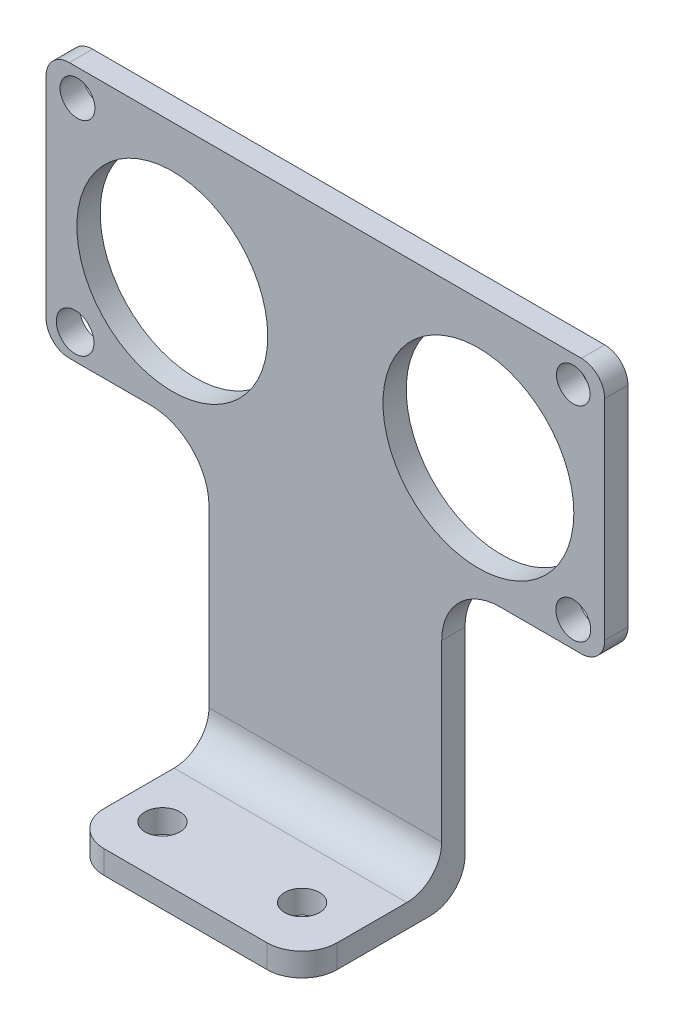
ISO-10303-21;
HEADER;
FILE_DESCRIPTION(('STEP AP214'),'2;1');
FILE_NAME('part.step','',(''),(''),'','','');
FILE_SCHEMA(('AUTOMOTIVE_DESIGN { 1 0 10303 214 1 1 1 1 }'));
ENDSEC;
DATA;
#1=APPLICATION_CONTEXT('core data for automotive mechanical design processes');
#2=APPLICATION_PROTOCOL_DEFINITION('international standard','automotive_design',2000,#1);
#3=PRODUCT_CONTEXT('',#1,'mechanical');
#4=PRODUCT('Part','Part','',(#3));
#5=PRODUCT_RELATED_PRODUCT_CATEGORY('part','',(#4));
#6=PRODUCT_DEFINITION_FORMATION('','',#4);
#7=PRODUCT_DEFINITION_CONTEXT('part definition',#1,'design');
#8=PRODUCT_DEFINITION('design','',#6,#7);
#9=PRODUCT_DEFINITION_SHAPE('','',#8);
#10=(LENGTH_UNIT() NAMED_UNIT(*) SI_UNIT(.MILLI.,.METRE.));
#11=(NAMED_UNIT(*) PLANE_ANGLE_UNIT() SI_UNIT($,.RADIAN.));
#12=(NAMED_UNIT(*) SI_UNIT($,.STERADIAN.) SOLID_ANGLE_UNIT());
#13=UNCERTAINTY_MEASURE_WITH_UNIT(LENGTH_MEASURE(1.E-05),#10,'distance_accuracy_value','');
#14=(GEOMETRIC_REPRESENTATION_CONTEXT(3) GLOBAL_UNCERTAINTY_ASSIGNED_CONTEXT((#13)) GLOBAL_UNIT_ASSIGNED_CONTEXT((#10,
#11,#12)) REPRESENTATION_CONTEXT('',''));
#15=CARTESIAN_POINT('',(0.,0.,0.));
#16=DIRECTION('',(0.,0.,1.));
#17=DIRECTION('',(1.,0.,0.));
#18=AXIS2_PLACEMENT_3D('',#15,#16,#17);
#19=CARTESIAN_POINT('',(24.2208067940552,-6.44798301486199,2.));
#20=DIRECTION('',(0.,0.,-1.));
#21=DIRECTION('',(-1.,0.,0.));
#22=AXIS2_PLACEMENT_3D('',#19,#20,#21);
#23=CYLINDRICAL_SURFACE('',#22,2.);
#24=CARTESIAN_POINT('',(24.2208067940552,-6.44798301486199,0.));
#25=DIRECTION('',(0.,0.,1.));
#26=DIRECTION('',(1.,0.,0.));
#27=AXIS2_PLACEMENT_3D('',#24,#25,#26);
#28=CIRCLE('',#27,2.);
#29=CARTESIAN_POINT('',(24.2208067940552,-8.44798301486199,0.));
#30=VERTEX_POINT('',#29);
#31=CARTESIAN_POINT('',(26.2208067940552,-6.44798301486198,0.));
#32=VERTEX_POINT('',#31);
#33=EDGE_CURVE('E195',#30,#32,#28,.T.);
#34=ORIENTED_EDGE('',*,*,#33,.T.);
#35=DIRECTION('',(0.,0.,-1.));
#36=VECTOR('',#35,1.);
#37=CARTESIAN_POINT('',(26.2208067940552,-6.44798301486198,2.));
#38=LINE('',#37,#36);
#39=CARTESIAN_POINT('',(26.2208067940552,-6.44798301486198,2.));
#40=VERTEX_POINT('',#39);
#41=EDGE_CURVE('E174',#40,#32,#38,.T.);
#42=ORIENTED_EDGE('',*,*,#41,.F.);
#43=CARTESIAN_POINT('',(24.2208067940552,-6.44798301486199,2.));
#44=DIRECTION('',(0.,0.,1.));
#45=DIRECTION('',(1.,0.,0.));
#46=AXIS2_PLACEMENT_3D('',#43,#44,#45);
#47=CIRCLE('',#46,2.);
#48=CARTESIAN_POINT('',(24.2208067940552,-8.44798301486199,2.));
#49=VERTEX_POINT('',#48);
#50=EDGE_CURVE('E181',#49,#40,#47,.T.);
#51=ORIENTED_EDGE('',*,*,#50,.F.);
#52=DIRECTION('',(0.,0.,-1.));
#53=VECTOR('',#52,1.);
#54=CARTESIAN_POINT('',(24.2208067940552,-8.44798301486199,2.));
#55=LINE('',#54,#53);
#56=EDGE_CURVE('E316',#49,#30,#55,.T.);
#57=ORIENTED_EDGE('',*,*,#56,.T.);
#58=EDGE_LOOP('',(#34,#42,#51,#57));
#59=FACE_BOUND('',#58,.T.);
#60=ADVANCED_FACE('F33',(#59),#23,.T.);
#61=CARTESIAN_POINT('',(26.2208067940552,11.552016985138,2.));
#62=DIRECTION('',(-1.,0.,0.));
#63=DIRECTION('',(0.,-1.,0.));
#64=AXIS2_PLACEMENT_3D('',#61,#62,#63);
#65=PLANE('',#64);
#66=DIRECTION('',(0.,1.,0.));
#67=VECTOR('',#66,1.);
#68=CARTESIAN_POINT('',(26.2208067940552,11.552016985138,0.));
#69=LINE('',#68,#67);
#70=CARTESIAN_POINT('',(26.2208067940552,11.552016985138,0.));
#71=VERTEX_POINT('',#70);
#72=EDGE_CURVE('E318',#32,#71,#69,.T.);
#73=ORIENTED_EDGE('',*,*,#72,.T.);
#74=DIRECTION('',(0.,0.,-1.));
#75=VECTOR('',#74,1.);
#76=CARTESIAN_POINT('',(26.2208067940552,11.552016985138,2.));
#77=LINE('',#76,#75);
#78=CARTESIAN_POINT('',(26.2208067940552,11.552016985138,2.));
#79=VERTEX_POINT('',#78);
#80=EDGE_CURVE('E177',#79,#71,#77,.T.);
#81=ORIENTED_EDGE('',*,*,#80,.F.);
#82=DIRECTION('',(0.,1.,0.));
#83=VECTOR('',#82,1.);
#84=CARTESIAN_POINT('',(26.2208067940552,11.552016985138,2.));
#85=LINE('',#84,#83);
#86=EDGE_CURVE('E170',#40,#79,#85,.T.);
#87=ORIENTED_EDGE('',*,*,#86,.F.);
#88=ORIENTED_EDGE('',*,*,#41,.T.);
#89=EDGE_LOOP('',(#73,#81,#87,#88));
#90=FACE_BOUND('',#89,.T.);
#91=ADVANCED_FACE('F172',(#90),#65,.F.);
#92=CARTESIAN_POINT('',(24.2208067940552,11.552016985138,2.));
#93=DIRECTION('',(0.,0.,-1.));
#94=DIRECTION('',(-1.,0.,0.));
#95=AXIS2_PLACEMENT_3D('',#92,#93,#94);
#96=CYLINDRICAL_SURFACE('',#95,2.);
#97=CARTESIAN_POINT('',(24.2208067940552,11.552016985138,0.));
#98=DIRECTION('',(0.,0.,1.));
#99=DIRECTION('',(-1.,0.,0.));
#100=AXIS2_PLACEMENT_3D('',#97,#98,#99);
#101=CIRCLE('',#100,2.);
#102=CARTESIAN_POINT('',(24.2208067940552,13.552016985138,0.));
#103=VERTEX_POINT('',#102);
#104=EDGE_CURVE('E320',#71,#103,#101,.T.);
#105=ORIENTED_EDGE('',*,*,#104,.T.);
#106=DIRECTION('',(0.,0.,-1.));
#107=VECTOR('',#106,1.);
#108=CARTESIAN_POINT('',(24.2208067940552,13.552016985138,2.));
#109=LINE('',#108,#107);
#110=CARTESIAN_POINT('',(24.2208067940552,13.552016985138,2.));
#111=VERTEX_POINT('',#110);
#112=EDGE_CURVE('E201',#111,#103,#109,.T.);
#113=ORIENTED_EDGE('',*,*,#112,.F.);
#114=CARTESIAN_POINT('',(24.2208067940552,11.552016985138,2.));
#115=DIRECTION('',(0.,0.,1.));
#116=DIRECTION('',(-1.,0.,0.));
#117=AXIS2_PLACEMENT_3D('',#114,#115,#116);
#118=CIRCLE('',#117,2.);
#119=EDGE_CURVE('E180',#79,#111,#118,.T.);
#120=ORIENTED_EDGE('',*,*,#119,.F.);
#121=ORIENTED_EDGE('',*,*,#80,.T.);
#122=EDGE_LOOP('',(#105,#113,#120,#121));
#123=FACE_BOUND('',#122,.T.);
#124=ADVANCED_FACE('F394',(#123),#96,.T.);
#125=CARTESIAN_POINT('',(-19.7791932059448,13.552016985138,2.));
#126=DIRECTION('',(0.,-1.,0.));
#127=DIRECTION('',(0.,0.,-1.));
#128=AXIS2_PLACEMENT_3D('',#125,#126,#127);
#129=PLANE('',#128);
#130=DIRECTION('',(-1.,0.,0.));
#131=VECTOR('',#130,1.);
#132=CARTESIAN_POINT('',(-19.7791932059448,13.552016985138,0.));
#133=LINE('',#132,#131);
#134=CARTESIAN_POINT('',(-19.7791932059448,13.552016985138,0.));
#135=VERTEX_POINT('',#134);
#136=EDGE_CURVE('E322',#103,#135,#133,.T.);
#137=ORIENTED_EDGE('',*,*,#136,.T.);
#138=DIRECTION('',(0.,0.,-1.));
#139=VECTOR('',#138,1.);
#140=CARTESIAN_POINT('',(-19.7791932059448,13.552016985138,2.));
#141=LINE('',#140,#139);
#142=CARTESIAN_POINT('',(-19.7791932059448,13.552016985138,2.));
#143=VERTEX_POINT('',#142);
#144=EDGE_CURVE('E367',#143,#135,#141,.T.);
#145=ORIENTED_EDGE('',*,*,#144,.F.);
#146=DIRECTION('',(-1.,0.,0.));
#147=VECTOR('',#146,1.);
#148=CARTESIAN_POINT('',(-19.7791932059448,13.552016985138,2.));
#149=LINE('',#148,#147);
#150=EDGE_CURVE('E297',#111,#143,#149,.T.);
#151=ORIENTED_EDGE('',*,*,#150,.F.);
#152=ORIENTED_EDGE('',*,*,#112,.T.);
#153=EDGE_LOOP('',(#137,#145,#151,#152));
#154=FACE_BOUND('',#153,.T.);
#155=ADVANCED_FACE('F374',(#154),#129,.F.);
#156=CARTESIAN_POINT('',(-19.7791932059448,11.552016985138,2.));
#157=DIRECTION('',(0.,0.,-1.));
#158=DIRECTION('',(-1.,0.,0.));
#159=AXIS2_PLACEMENT_3D('',#156,#157,#158);
#160=CYLINDRICAL_SURFACE('',#159,2.);
#161=CARTESIAN_POINT('',(-19.7791932059448,11.552016985138,0.));
#162=DIRECTION('',(0.,0.,1.));
#163=DIRECTION('',(1.,0.,0.));
#164=AXIS2_PLACEMENT_3D('',#161,#162,#163);
#165=CIRCLE('',#164,2.);
#166=CARTESIAN_POINT('',(-21.7791932059448,11.552016985138,0.));
#167=VERTEX_POINT('',#166);
#168=EDGE_CURVE('E324',#135,#167,#165,.T.);
#169=ORIENTED_EDGE('',*,*,#168,.T.);
#170=DIRECTION('',(0.,0.,-1.));
#171=VECTOR('',#170,1.);
#172=CARTESIAN_POINT('',(-21.7791932059448,11.552016985138,2.));
#173=LINE('',#172,#171);
#174=CARTESIAN_POINT('',(-21.7791932059448,11.552016985138,2.));
#175=VERTEX_POINT('',#174);
#176=EDGE_CURVE('E364',#175,#167,#173,.T.);
#177=ORIENTED_EDGE('',*,*,#176,.F.);
#178=CARTESIAN_POINT('',(-19.7791932059448,11.552016985138,2.));
#179=DIRECTION('',(0.,0.,1.));
#180=DIRECTION('',(1.,0.,0.));
#181=AXIS2_PLACEMENT_3D('',#178,#179,#180);
#182=CIRCLE('',#181,2.);
#183=EDGE_CURVE('E299',#143,#175,#182,.T.);
#184=ORIENTED_EDGE('',*,*,#183,.F.);
#185=ORIENTED_EDGE('',*,*,#144,.T.);
#186=EDGE_LOOP('',(#169,#177,#184,#185));
#187=FACE_BOUND('',#186,.T.);
#188=ADVANCED_FACE('F386',(#187),#160,.T.);
#189=CARTESIAN_POINT('',(-21.7791932059448,11.552016985138,2.));
#190=DIRECTION('',(1.,0.,0.));
#191=DIRECTION('',(0.,0.,-1.));
#192=AXIS2_PLACEMENT_3D('',#189,#190,#191);
#193=PLANE('',#192);
#194=DIRECTION('',(0.,-1.,0.));
#195=VECTOR('',#194,1.);
#196=CARTESIAN_POINT('',(-21.7791932059448,11.552016985138,0.));
#197=LINE('',#196,#195);
#198=CARTESIAN_POINT('',(-21.7791932059448,-6.44798301486198,0.));
#199=VERTEX_POINT('',#198);
#200=EDGE_CURVE('E326',#167,#199,#197,.T.);
#201=ORIENTED_EDGE('',*,*,#200,.T.);
#202=DIRECTION('',(0.,0.,-1.));
#203=VECTOR('',#202,1.);
#204=CARTESIAN_POINT('',(-21.7791932059448,-6.44798301486198,2.));
#205=LINE('',#204,#203);
#206=CARTESIAN_POINT('',(-21.7791932059448,-6.44798301486198,2.));
#207=VERTEX_POINT('',#206);
#208=EDGE_CURVE('E361',#207,#199,#205,.T.);
#209=ORIENTED_EDGE('',*,*,#208,.F.);
#210=DIRECTION('',(0.,-1.,0.));
#211=VECTOR('',#210,1.);
#212=CARTESIAN_POINT('',(-21.7791932059448,11.552016985138,2.));
#213=LINE('',#212,#211);
#214=EDGE_CURVE('E301',#175,#207,#213,.T.);
#215=ORIENTED_EDGE('',*,*,#214,.F.);
#216=ORIENTED_EDGE('',*,*,#176,.T.);
#217=EDGE_LOOP('',(#201,#209,#215,#216));
#218=FACE_BOUND('',#217,.T.);
#219=ADVANCED_FACE('F390',(#218),#193,.F.);
#220=CARTESIAN_POINT('',(-19.7791932059448,-6.44798301486199,2.));
#221=DIRECTION('',(0.,0.,-1.));
#222=DIRECTION('',(-1.,0.,0.));
#223=AXIS2_PLACEMENT_3D('',#220,#221,#222);
#224=CYLINDRICAL_SURFACE('',#223,2.);
#225=CARTESIAN_POINT('',(-19.7791932059448,-6.44798301486199,0.));
#226=DIRECTION('',(0.,0.,1.));
#227=DIRECTION('',(1.,0.,0.));
#228=AXIS2_PLACEMENT_3D('',#225,#226,#227);
#229=CIRCLE('',#228,2.);
#230=CARTESIAN_POINT('',(-19.7791932059448,-8.44798301486199,0.));
#231=VERTEX_POINT('',#230);
#232=EDGE_CURVE('E328',#199,#231,#229,.T.);
#233=ORIENTED_EDGE('',*,*,#232,.T.);
#234=DIRECTION('',(0.,0.,-1.));
#235=VECTOR('',#234,1.);
#236=CARTESIAN_POINT('',(-19.7791932059448,-8.44798301486199,2.));
#237=LINE('',#236,#235);
#238=CARTESIAN_POINT('',(-19.7791932059448,-8.44798301486199,2.));
#239=VERTEX_POINT('',#238);
#240=EDGE_CURVE('E358',#239,#231,#237,.T.);
#241=ORIENTED_EDGE('',*,*,#240,.F.);
#242=CARTESIAN_POINT('',(-19.7791932059448,-6.44798301486199,2.));
#243=DIRECTION('',(0.,0.,1.));
#244=DIRECTION('',(1.,0.,0.));
#245=AXIS2_PLACEMENT_3D('',#242,#243,#244);
#246=CIRCLE('',#245,2.);
#247=EDGE_CURVE('E303',#207,#239,#246,.T.);
#248=ORIENTED_EDGE('',*,*,#247,.F.);
#249=ORIENTED_EDGE('',*,*,#208,.T.);
#250=EDGE_LOOP('',(#233,#241,#248,#249));
#251=FACE_BOUND('',#250,.T.);
#252=ADVANCED_FACE('F491',(#251),#224,.T.);
#253=CARTESIAN_POINT('',(-19.7791932059448,-8.44798301486199,2.));
#254=DIRECTION('',(0.,1.,0.));
#255=DIRECTION('',(-1.,0.,0.));
#256=AXIS2_PLACEMENT_3D('',#253,#254,#255);
#257=PLANE('',#256);
#258=DIRECTION('',(1.,0.,0.));
#259=VECTOR('',#258,1.);
#260=CARTESIAN_POINT('',(-19.7791932059448,-8.44798301486199,0.));
#261=LINE('',#260,#259);
#262=CARTESIAN_POINT('',(-12.7791932059448,-8.44798301486199,0.));
#263=VERTEX_POINT('',#262);
#264=EDGE_CURVE('E330',#231,#263,#261,.T.);
#265=ORIENTED_EDGE('',*,*,#264,.T.);
#266=DIRECTION('',(0.,0.,-1.));
#267=VECTOR('',#266,1.);
#268=CARTESIAN_POINT('',(-12.7791932059448,-8.44798301486199,2.));
#269=LINE('',#268,#267);
#270=CARTESIAN_POINT('',(-12.7791932059448,-8.44798301486199,2.));
#271=VERTEX_POINT('',#270);
#272=EDGE_CURVE('E355',#271,#263,#269,.T.);
#273=ORIENTED_EDGE('',*,*,#272,.F.);
#274=DIRECTION('',(1.,0.,0.));
#275=VECTOR('',#274,1.);
#276=CARTESIAN_POINT('',(-19.7791932059448,-8.44798301486199,2.));
#277=LINE('',#276,#275);
#278=EDGE_CURVE('E305',#239,#271,#277,.T.);
#279=ORIENTED_EDGE('',*,*,#278,.F.);
#280=ORIENTED_EDGE('',*,*,#240,.T.);
#281=EDGE_LOOP('',(#265,#273,#279,#280));
#282=FACE_BOUND('',#281,.T.);
#283=ADVANCED_FACE('F487',(#282),#257,.F.);
#284=CARTESIAN_POINT('',(-12.7791932059448,-13.447983014862,2.));
#285=DIRECTION('',(0.,0.,-1.));
#286=DIRECTION('',(-1.,0.,0.));
#287=AXIS2_PLACEMENT_3D('',#284,#285,#286);
#288=CYLINDRICAL_SURFACE('',#287,5.);
#289=CARTESIAN_POINT('',(-12.7791932059448,-13.447983014862,0.));
#290=DIRECTION('',(0.,0.,-1.));
#291=DIRECTION('',(1.,0.,0.));
#292=AXIS2_PLACEMENT_3D('',#289,#290,#291);
#293=CIRCLE('',#292,5.);
#294=CARTESIAN_POINT('',(-7.77919320594479,-13.447983014862,0.));
#295=VERTEX_POINT('',#294);
#296=EDGE_CURVE('E332',#263,#295,#293,.T.);
#297=ORIENTED_EDGE('',*,*,#296,.T.);
#298=DIRECTION('',(0.,0.,-1.));
#299=VECTOR('',#298,1.);
#300=CARTESIAN_POINT('',(-7.77919320594479,-13.447983014862,2.));
#301=LINE('',#300,#299);
#302=CARTESIAN_POINT('',(-7.77919320594479,-13.447983014862,2.));
#303=VERTEX_POINT('',#302);
#304=EDGE_CURVE('E352',#303,#295,#301,.T.);
#305=ORIENTED_EDGE('',*,*,#304,.F.);
#306=CARTESIAN_POINT('',(-12.7791932059448,-13.447983014862,2.));
#307=DIRECTION('',(0.,0.,-1.));
#308=DIRECTION('',(1.,0.,0.));
#309=AXIS2_PLACEMENT_3D('',#306,#307,#308);
#310=CIRCLE('',#309,5.);
#311=EDGE_CURVE('E307',#271,#303,#310,.T.);
#312=ORIENTED_EDGE('',*,*,#311,.F.);
#313=ORIENTED_EDGE('',*,*,#272,.T.);
#314=EDGE_LOOP('',(#297,#305,#312,#313));
#315=FACE_BOUND('',#314,.T.);
#316=ADVANCED_FACE('F483',(#315),#288,.F.);
#317=CARTESIAN_POINT('',(-7.77919320594479,-13.447983014862,2.));
#318=DIRECTION('',(1.,0.,0.));
#319=DIRECTION('',(0.,0.,-1.));
#320=AXIS2_PLACEMENT_3D('',#317,#318,#319);
#321=PLANE('',#320);
#322=DIRECTION('',(0.,0.,-1.));
#323=VECTOR('',#322,1.);
#324=CARTESIAN_POINT('',(-7.77919320594479,-33.447983014862,2.));
#325=LINE('',#324,#323);
#326=CARTESIAN_POINT('',(-7.77919320594479,-33.447983014862,11.));
#327=VERTEX_POINT('',#326);
#328=CARTESIAN_POINT('',(-7.77919320594479,-33.447983014862,3.));
#329=VERTEX_POINT('',#328);
#330=EDGE_CURVE('E350',#327,#329,#325,.T.);
#331=ORIENTED_EDGE('',*,*,#330,.F.);
#332=DIRECTION('',(0.,-1.,0.));
#333=VECTOR('',#332,1.);
#334=CARTESIAN_POINT('',(-7.77919320594479,-31.447983014862,11.));
#335=LINE('',#334,#333);
#336=CARTESIAN_POINT('',(-7.77919320594479,-31.447983014862,11.));
#337=VERTEX_POINT('',#336);
#338=EDGE_CURVE('E11',#327,#337,#335,.F.);
#339=ORIENTED_EDGE('',*,*,#338,.T.);
#340=DIRECTION('',(0.,0.,-1.));
#341=VECTOR('',#340,1.);
#342=CARTESIAN_POINT('',(-7.77919320594479,-31.447983014862,14.));
#343=LINE('',#342,#341);
#344=CARTESIAN_POINT('',(-7.77919320594479,-31.447983014862,5.));
#345=VERTEX_POINT('',#344);
#346=EDGE_CURVE('E256',#337,#345,#343,.T.);
#347=ORIENTED_EDGE('',*,*,#346,.T.);
#348=CARTESIAN_POINT('',(-7.77919320594479,-28.447983014862,5.));
#349=DIRECTION('',(1.,0.,0.));
#350=DIRECTION('',(0.,0.,-1.));
#351=AXIS2_PLACEMENT_3D('',#348,#349,#350);
#352=CIRCLE('',#351,3.);
#353=CARTESIAN_POINT('',(-7.77919320594479,-28.447983014862,2.));
#354=VERTEX_POINT('',#353);
#355=EDGE_CURVE('E216',#345,#354,#352,.T.);
#356=ORIENTED_EDGE('',*,*,#355,.T.);
#357=DIRECTION('',(0.,-1.,0.));
#358=VECTOR('',#357,1.);
#359=CARTESIAN_POINT('',(-7.77919320594479,-13.447983014862,2.));
#360=LINE('',#359,#358);
#361=EDGE_CURVE('E309',#303,#354,#360,.T.);
#362=ORIENTED_EDGE('',*,*,#361,.F.);
#363=ORIENTED_EDGE('',*,*,#304,.T.);
#364=DIRECTION('',(0.,-1.,0.));
#365=VECTOR('',#364,1.);
#366=CARTESIAN_POINT('',(-7.77919320594479,-13.447983014862,0.));
#367=LINE('',#366,#365);
#368=CARTESIAN_POINT('',(-7.77919320594479,-30.447983014862,0.));
#369=VERTEX_POINT('',#368);
#370=EDGE_CURVE('E334',#295,#369,#367,.T.);
#371=ORIENTED_EDGE('',*,*,#370,.T.);
#372=CARTESIAN_POINT('',(-7.77919320594479,-30.447983014862,3.));
#373=DIRECTION('',(1.,0.,0.));
#374=DIRECTION('',(0.,0.,-1.));
#375=AXIS2_PLACEMENT_3D('',#372,#373,#374);
#376=CIRCLE('',#375,3.);
#377=EDGE_CURVE('E208',#369,#329,#376,.F.);
#378=ORIENTED_EDGE('',*,*,#377,.T.);
#379=EDGE_LOOP('',(#331,#339,#347,#356,#362,#363,#371,#378));
#380=FACE_BOUND('',#379,.T.);
#381=ADVANCED_FACE('F479',(#380),#321,.F.);
#382=CARTESIAN_POINT('',(-7.77919320594479,-33.447983014862,2.));
#383=DIRECTION('',(0.,1.,0.));
#384=DIRECTION('',(0.,0.,1.));
#385=AXIS2_PLACEMENT_3D('',#382,#383,#384);
#386=PLANE('',#385);
#387=CARTESIAN_POINT('',(-4.27919320594479,-33.447983014862,9.5));
#388=DIRECTION('',(0.,1.,0.));
#389=DIRECTION('',(0.,0.,1.));
#390=AXIS2_PLACEMENT_3D('',#387,#388,#389);
#391=CIRCLE('',#390,1.5);
#392=CARTESIAN_POINT('',(-4.27919320594479,-33.447983014862,11.));
#393=VERTEX_POINT('',#392);
#394=EDGE_CURVE('E245',#393,#393,#391,.T.);
#395=ORIENTED_EDGE('',*,*,#394,.T.);
#396=EDGE_LOOP('',(#395));
#397=FACE_BOUND('',#396,.T.);
#398=CARTESIAN_POINT('',(7.72080679405521,-33.447983014862,9.5));
#399=DIRECTION('',(0.,1.,0.));
#400=DIRECTION('',(0.,0.,1.));
#401=AXIS2_PLACEMENT_3D('',#398,#399,#400);
#402=CIRCLE('',#401,1.5);
#403=CARTESIAN_POINT('',(7.72080679405521,-33.447983014862,11.));
#404=VERTEX_POINT('',#403);
#405=EDGE_CURVE('E706',#404,#404,#402,.T.);
#406=ORIENTED_EDGE('',*,*,#405,.T.);
#407=EDGE_LOOP('',(#406));
#408=FACE_BOUND('',#407,.T.);
#409=DIRECTION('',(0.,0.,-1.));
#410=VECTOR('',#409,1.);
#411=CARTESIAN_POINT('',(12.2208067940552,-33.447983014862,2.));
#412=LINE('',#411,#410);
#413=CARTESIAN_POINT('',(12.2208067940552,-33.447983014862,11.));
#414=VERTEX_POINT('',#413);
#415=CARTESIAN_POINT('',(12.2208067940552,-33.447983014862,3.));
#416=VERTEX_POINT('',#415);
#417=EDGE_CURVE('E236',#414,#416,#412,.T.);
#418=ORIENTED_EDGE('',*,*,#417,.F.);
#419=CARTESIAN_POINT('',(9.22080679405522,-33.447983014862,11.));
#420=DIRECTION('',(0.,1.,0.));
#421=DIRECTION('',(0.,0.,1.));
#422=AXIS2_PLACEMENT_3D('',#419,#420,#421);
#423=CIRCLE('',#422,3.);
#424=CARTESIAN_POINT('',(9.22080679405522,-33.447983014862,14.));
#425=VERTEX_POINT('',#424);
#426=EDGE_CURVE('E41',#414,#425,#423,.F.);
#427=ORIENTED_EDGE('',*,*,#426,.T.);
#428=DIRECTION('',(1.,0.,0.));
#429=VECTOR('',#428,1.);
#430=CARTESIAN_POINT('',(-7.77919320594479,-33.447983014862,14.));
#431=LINE('',#430,#429);
#432=CARTESIAN_POINT('',(-4.77919320594479,-33.447983014862,14.));
#433=VERTEX_POINT('',#432);
#434=EDGE_CURVE('E235',#433,#425,#431,.T.);
#435=ORIENTED_EDGE('',*,*,#434,.F.);
#436=CARTESIAN_POINT('',(-4.77919320594479,-33.447983014862,11.));
#437=DIRECTION('',(0.,1.,0.));
#438=DIRECTION('',(0.,0.,1.));
#439=AXIS2_PLACEMENT_3D('',#436,#437,#438);
#440=CIRCLE('',#439,3.);
#441=EDGE_CURVE('E48',#433,#327,#440,.F.);
#442=ORIENTED_EDGE('',*,*,#441,.T.);
#443=ORIENTED_EDGE('',*,*,#330,.T.);
#444=DIRECTION('',(1.,0.,0.));
#445=VECTOR('',#444,1.);
#446=CARTESIAN_POINT('',(-7.77919320594479,-33.447983014862,3.));
#447=LINE('',#446,#445);
#448=EDGE_CURVE('E196',#329,#416,#447,.T.);
#449=ORIENTED_EDGE('',*,*,#448,.T.);
#450=EDGE_LOOP('',(#418,#427,#435,#442,#443,#449));
#451=FACE_BOUND('',#450,.T.);
#452=ADVANCED_FACE('F234',(#397,#408,#451),#386,.F.);
#453=CARTESIAN_POINT('',(12.2208067940552,-13.447983014862,2.));
#454=DIRECTION('',(-1.,0.,0.));
#455=DIRECTION('',(0.,-1.,0.));
#456=AXIS2_PLACEMENT_3D('',#453,#454,#455);
#457=PLANE('',#456);
#458=DIRECTION('',(0.,0.,-1.));
#459=VECTOR('',#458,1.);
#460=CARTESIAN_POINT('',(12.2208067940552,-31.447983014862,14.));
#461=LINE('',#460,#459);
#462=CARTESIAN_POINT('',(12.2208067940552,-31.447983014862,11.));
#463=VERTEX_POINT('',#462);
#464=CARTESIAN_POINT('',(12.2208067940552,-31.447983014862,5.));
#465=VERTEX_POINT('',#464);
#466=EDGE_CURVE('E250',#463,#465,#461,.T.);
#467=ORIENTED_EDGE('',*,*,#466,.F.);
#468=DIRECTION('',(0.,1.,0.));
#469=VECTOR('',#468,1.);
#470=CARTESIAN_POINT('',(12.2208067940552,-33.447983014862,11.));
#471=LINE('',#470,#469);
#472=EDGE_CURVE('E56',#463,#414,#471,.F.);
#473=ORIENTED_EDGE('',*,*,#472,.T.);
#474=ORIENTED_EDGE('',*,*,#417,.T.);
#475=CARTESIAN_POINT('',(12.2208067940552,-30.447983014862,3.));
#476=DIRECTION('',(-1.,0.,0.));
#477=DIRECTION('',(0.,-1.,0.));
#478=AXIS2_PLACEMENT_3D('',#475,#476,#477);
#479=CIRCLE('',#478,3.);
#480=CARTESIAN_POINT('',(12.2208067940552,-30.447983014862,0.));
#481=VERTEX_POINT('',#480);
#482=EDGE_CURVE('E199',#416,#481,#479,.F.);
#483=ORIENTED_EDGE('',*,*,#482,.T.);
#484=DIRECTION('',(0.,1.,0.));
#485=VECTOR('',#484,1.);
#486=CARTESIAN_POINT('',(12.2208067940552,-13.447983014862,0.));
#487=LINE('',#486,#485);
#488=CARTESIAN_POINT('',(12.2208067940552,-13.447983014862,0.));
#489=VERTEX_POINT('',#488);
#490=EDGE_CURVE('E337',#481,#489,#487,.T.);
#491=ORIENTED_EDGE('',*,*,#490,.T.);
#492=DIRECTION('',(0.,0.,-1.));
#493=VECTOR('',#492,1.);
#494=CARTESIAN_POINT('',(12.2208067940552,-13.447983014862,2.));
#495=LINE('',#494,#493);
#496=CARTESIAN_POINT('',(12.2208067940552,-13.447983014862,2.));
#497=VERTEX_POINT('',#496);
#498=EDGE_CURVE('E346',#497,#489,#495,.T.);
#499=ORIENTED_EDGE('',*,*,#498,.F.);
#500=DIRECTION('',(0.,1.,0.));
#501=VECTOR('',#500,1.);
#502=CARTESIAN_POINT('',(12.2208067940552,-13.447983014862,2.));
#503=LINE('',#502,#501);
#504=CARTESIAN_POINT('',(12.2208067940552,-28.447983014862,2.));
#505=VERTEX_POINT('',#504);
#506=EDGE_CURVE('E311',#505,#497,#503,.T.);
#507=ORIENTED_EDGE('',*,*,#506,.F.);
#508=CARTESIAN_POINT('',(12.2208067940552,-28.447983014862,5.));
#509=DIRECTION('',(-1.,0.,0.));
#510=DIRECTION('',(0.,-1.,0.));
#511=AXIS2_PLACEMENT_3D('',#508,#509,#510);
#512=CIRCLE('',#511,3.);
#513=EDGE_CURVE('E218',#505,#465,#512,.T.);
#514=ORIENTED_EDGE('',*,*,#513,.T.);
#515=EDGE_LOOP('',(#467,#473,#474,#483,#491,#499,#507,#514));
#516=FACE_BOUND('',#515,.T.);
#517=ADVANCED_FACE('F251',(#516),#457,.F.);
#518=CARTESIAN_POINT('',(17.2208067940552,-13.447983014862,2.));
#519=DIRECTION('',(0.,0.,-1.));
#520=DIRECTION('',(-1.,0.,0.));
#521=AXIS2_PLACEMENT_3D('',#518,#519,#520);
#522=CYLINDRICAL_SURFACE('',#521,5.);
#523=CARTESIAN_POINT('',(17.2208067940552,-13.447983014862,0.));
#524=DIRECTION('',(0.,0.,-1.));
#525=DIRECTION('',(-1.,0.,0.));
#526=AXIS2_PLACEMENT_3D('',#523,#524,#525);
#527=CIRCLE('',#526,5.);
#528=CARTESIAN_POINT('',(17.2208067940552,-8.44798301486199,0.));
#529=VERTEX_POINT('',#528);
#530=EDGE_CURVE('E339',#489,#529,#527,.T.);
#531=ORIENTED_EDGE('',*,*,#530,.T.);
#532=DIRECTION('',(0.,0.,-1.));
#533=VECTOR('',#532,1.);
#534=CARTESIAN_POINT('',(17.2208067940552,-8.44798301486199,2.));
#535=LINE('',#534,#533);
#536=CARTESIAN_POINT('',(17.2208067940552,-8.44798301486199,2.));
#537=VERTEX_POINT('',#536);
#538=EDGE_CURVE('E343',#537,#529,#535,.T.);
#539=ORIENTED_EDGE('',*,*,#538,.F.);
#540=CARTESIAN_POINT('',(17.2208067940552,-13.447983014862,2.));
#541=DIRECTION('',(0.,0.,-1.));
#542=DIRECTION('',(-1.,0.,0.));
#543=AXIS2_PLACEMENT_3D('',#540,#541,#542);
#544=CIRCLE('',#543,5.);
#545=EDGE_CURVE('E313',#497,#537,#544,.T.);
#546=ORIENTED_EDGE('',*,*,#545,.F.);
#547=ORIENTED_EDGE('',*,*,#498,.T.);
#548=EDGE_LOOP('',(#531,#539,#546,#547));
#549=FACE_BOUND('',#548,.T.);
#550=ADVANCED_FACE('F470',(#549),#522,.F.);
#551=CARTESIAN_POINT('',(24.2208067940552,-8.44798301486199,2.));
#552=DIRECTION('',(0.,1.,0.));
#553=DIRECTION('',(0.,0.,1.));
#554=AXIS2_PLACEMENT_3D('',#551,#552,#553);
#555=PLANE('',#554);
#556=DIRECTION('',(1.,0.,0.));
#557=VECTOR('',#556,1.);
#558=CARTESIAN_POINT('',(24.2208067940552,-8.44798301486199,0.));
#559=LINE('',#558,#557);
#560=EDGE_CURVE('E192',#529,#30,#559,.T.);
#561=ORIENTED_EDGE('',*,*,#560,.T.);
#562=ORIENTED_EDGE('',*,*,#56,.F.);
#563=DIRECTION('',(1.,0.,0.));
#564=VECTOR('',#563,1.);
#565=CARTESIAN_POINT('',(24.2208067940552,-8.44798301486199,2.));
#566=LINE('',#565,#564);
#567=EDGE_CURVE('E188',#537,#49,#566,.T.);
#568=ORIENTED_EDGE('',*,*,#567,.F.);
#569=ORIENTED_EDGE('',*,*,#538,.T.);
#570=EDGE_LOOP('',(#561,#562,#568,#569));
#571=FACE_BOUND('',#570,.T.);
#572=ADVANCED_FACE('F464',(#571),#555,.F.);
#573=CARTESIAN_POINT('',(24.2208067940552,-6.44798301486199,2.));
#574=DIRECTION('',(0.,0.,1.));
#575=DIRECTION('',(1.,0.,0.));
#576=AXIS2_PLACEMENT_3D('',#573,#574,#575);
#577=PLANE('',#576);
#578=ORIENTED_EDGE('',*,*,#361,.T.);
#579=DIRECTION('',(-1.,0.,0.));
#580=VECTOR('',#579,1.);
#581=CARTESIAN_POINT('',(24.2208067940552,-28.447983014862,2.));
#582=LINE('',#581,#580);
#583=EDGE_CURVE('E214',#354,#505,#582,.F.);
#584=ORIENTED_EDGE('',*,*,#583,.T.);
#585=ORIENTED_EDGE('',*,*,#506,.T.);
#586=ORIENTED_EDGE('',*,*,#545,.T.);
#587=ORIENTED_EDGE('',*,*,#567,.T.);
#588=ORIENTED_EDGE('',*,*,#50,.T.);
#589=ORIENTED_EDGE('',*,*,#86,.T.);
#590=ORIENTED_EDGE('',*,*,#119,.T.);
#591=ORIENTED_EDGE('',*,*,#150,.T.);
#592=ORIENTED_EDGE('',*,*,#183,.T.);
#593=ORIENTED_EDGE('',*,*,#214,.T.);
#594=ORIENTED_EDGE('',*,*,#247,.T.);
#595=ORIENTED_EDGE('',*,*,#278,.T.);
#596=ORIENTED_EDGE('',*,*,#311,.T.);
#597=EDGE_LOOP('',(#578,#584,#585,#586,#587,#588,#589,#590,#591,#592,#593,#594,#595,#596));
#598=FACE_BOUND('',#597,.T.);
#599=CARTESIAN_POINT('',(-19.2791932059448,-6.24798301486199,2.));
#600=DIRECTION('',(0.,0.,1.));
#601=DIRECTION('',(1.,0.,0.));
#602=AXIS2_PLACEMENT_3D('',#599,#600,#601);
#603=CIRCLE('',#602,1.61866088844037);
#604=CARTESIAN_POINT('',(-17.6605323175044,-6.24798301486199,2.));
#605=VERTEX_POINT('',#604);
#606=EDGE_CURVE('E271',#605,#605,#603,.T.);
#607=ORIENTED_EDGE('',*,*,#606,.F.);
#608=EDGE_LOOP('',(#607));
#609=FACE_BOUND('',#608,.T.);
#610=CARTESIAN_POINT('',(23.5208067940552,11.252016985138,2.));
#611=DIRECTION('',(0.,0.,1.));
#612=DIRECTION('',(1.,0.,0.));
#613=AXIS2_PLACEMENT_3D('',#610,#611,#612);
#614=CIRCLE('',#613,1.4412966753416);
#615=CARTESIAN_POINT('',(24.9621034693968,11.252016985138,2.));
#616=VERTEX_POINT('',#615);
#617=EDGE_CURVE('E265',#616,#616,#614,.T.);
#618=ORIENTED_EDGE('',*,*,#617,.F.);
#619=EDGE_LOOP('',(#618));
#620=FACE_BOUND('',#619,.T.);
#621=CARTESIAN_POINT('',(23.5208067940552,-6.24798301486199,2.));
#622=DIRECTION('',(0.,0.,1.));
#623=DIRECTION('',(1.,0.,0.));
#624=AXIS2_PLACEMENT_3D('',#621,#622,#623);
#625=CIRCLE('',#624,1.5);
#626=CARTESIAN_POINT('',(25.0208067940552,-6.24798301486199,2.));
#627=VERTEX_POINT('',#626);
#628=EDGE_CURVE('E255',#627,#627,#625,.T.);
#629=ORIENTED_EDGE('',*,*,#628,.F.);
#630=EDGE_LOOP('',(#629));
#631=FACE_BOUND('',#630,.T.);
#632=CARTESIAN_POINT('',(-19.0791932059448,11.252016985138,2.));
#633=DIRECTION('',(0.,0.,1.));
#634=DIRECTION('',(1.,0.,0.));
#635=AXIS2_PLACEMENT_3D('',#632,#633,#634);
#636=CIRCLE('',#635,1.5);
#637=CARTESIAN_POINT('',(-17.5791932059448,11.252016985138,2.));
#638=VERTEX_POINT('',#637);
#639=EDGE_CURVE('E270',#638,#638,#636,.T.);
#640=ORIENTED_EDGE('',*,*,#639,.F.);
#641=EDGE_LOOP('',(#640));
#642=FACE_BOUND('',#641,.T.);
#643=CARTESIAN_POINT('',(-10.9291932059448,1.70201698513801,2.));
#644=DIRECTION('',(0.,0.,1.));
#645=DIRECTION('',(1.,0.,0.));
#646=AXIS2_PLACEMENT_3D('',#643,#644,#645);
#647=CIRCLE('',#646,8.2);
#648=CARTESIAN_POINT('',(-2.72919320594479,1.70201698513801,2.));
#649=VERTEX_POINT('',#648);
#650=EDGE_CURVE('E288',#649,#649,#647,.T.);
#651=ORIENTED_EDGE('',*,*,#650,.F.);
#652=EDGE_LOOP('',(#651));
#653=FACE_BOUND('',#652,.T.);
#654=CARTESIAN_POINT('',(15.3708067940552,1.70201698513801,2.));
#655=DIRECTION('',(0.,0.,1.));
#656=DIRECTION('',(1.,0.,0.));
#657=AXIS2_PLACEMENT_3D('',#654,#655,#656);
#658=CIRCLE('',#657,8.2);
#659=CARTESIAN_POINT('',(23.5708067940552,1.70201698513801,2.));
#660=VERTEX_POINT('',#659);
#661=EDGE_CURVE('E282',#660,#660,#658,.T.);
#662=ORIENTED_EDGE('',*,*,#661,.F.);
#663=EDGE_LOOP('',(#662));
#664=FACE_BOUND('',#663,.T.);
#665=ADVANCED_FACE('F185',(#598,#609,#620,#631,#642,#653,#664),#577,.T.);
#666=CARTESIAN_POINT('',(24.2208067940552,-6.44798301486199,0.));
#667=DIRECTION('',(0.,0.,1.));
#668=DIRECTION('',(1.,0.,0.));
#669=AXIS2_PLACEMENT_3D('',#666,#667,#668);
#670=PLANE('',#669);
#671=CARTESIAN_POINT('',(-19.2791932059448,-6.24798301486199,0.));
#672=DIRECTION('',(0.,0.,1.));
#673=DIRECTION('',(1.,0.,0.));
#674=AXIS2_PLACEMENT_3D('',#671,#672,#673);
#675=CIRCLE('',#674,1.61866088844037);
#676=CARTESIAN_POINT('',(-17.6605323175044,-6.24798301486199,0.));
#677=VERTEX_POINT('',#676);
#678=EDGE_CURVE('E267',#677,#677,#675,.T.);
#679=ORIENTED_EDGE('',*,*,#678,.T.);
#680=EDGE_LOOP('',(#679));
#681=FACE_BOUND('',#680,.T.);
#682=CARTESIAN_POINT('',(23.5208067940552,11.252016985138,0.));
#683=DIRECTION('',(0.,0.,1.));
#684=DIRECTION('',(1.,0.,0.));
#685=AXIS2_PLACEMENT_3D('',#682,#683,#684);
#686=CIRCLE('',#685,1.4412966753416);
#687=CARTESIAN_POINT('',(24.9621034693968,11.252016985138,0.));
#688=VERTEX_POINT('',#687);
#689=EDGE_CURVE('E274',#688,#688,#686,.T.);
#690=ORIENTED_EDGE('',*,*,#689,.T.);
#691=EDGE_LOOP('',(#690));
#692=FACE_BOUND('',#691,.T.);
#693=CARTESIAN_POINT('',(23.5208067940552,-6.24798301486199,0.));
#694=DIRECTION('',(0.,0.,1.));
#695=DIRECTION('',(1.,0.,0.));
#696=AXIS2_PLACEMENT_3D('',#693,#694,#695);
#697=CIRCLE('',#696,1.5);
#698=CARTESIAN_POINT('',(25.0208067940552,-6.24798301486199,0.));
#699=VERTEX_POINT('',#698);
#700=EDGE_CURVE('E259',#699,#699,#697,.T.);
#701=ORIENTED_EDGE('',*,*,#700,.T.);
#702=EDGE_LOOP('',(#701));
#703=FACE_BOUND('',#702,.T.);
#704=CARTESIAN_POINT('',(-19.0791932059448,11.252016985138,0.));
#705=DIRECTION('',(0.,0.,1.));
#706=DIRECTION('',(1.,0.,0.));
#707=AXIS2_PLACEMENT_3D('',#704,#705,#706);
#708=CIRCLE('',#707,1.5);
#709=CARTESIAN_POINT('',(-17.5791932059448,11.252016985138,0.));
#710=VERTEX_POINT('',#709);
#711=EDGE_CURVE('E279',#710,#710,#708,.T.);
#712=ORIENTED_EDGE('',*,*,#711,.T.);
#713=EDGE_LOOP('',(#712));
#714=FACE_BOUND('',#713,.T.);
#715=CARTESIAN_POINT('',(-10.9291932059448,1.70201698513801,0.));
#716=DIRECTION('',(0.,0.,1.));
#717=DIRECTION('',(1.,0.,0.));
#718=AXIS2_PLACEMENT_3D('',#715,#716,#717);
#719=CIRCLE('',#718,8.2);
#720=CARTESIAN_POINT('',(-2.72919320594479,1.70201698513801,0.));
#721=VERTEX_POINT('',#720);
#722=EDGE_CURVE('E285',#721,#721,#719,.T.);
#723=ORIENTED_EDGE('',*,*,#722,.T.);
#724=EDGE_LOOP('',(#723));
#725=FACE_BOUND('',#724,.T.);
#726=CARTESIAN_POINT('',(15.3708067940552,1.70201698513801,0.));
#727=DIRECTION('',(0.,0.,1.));
#728=DIRECTION('',(1.,0.,0.));
#729=AXIS2_PLACEMENT_3D('',#726,#727,#728);
#730=CIRCLE('',#729,8.2);
#731=CARTESIAN_POINT('',(23.5708067940552,1.70201698513801,0.));
#732=VERTEX_POINT('',#731);
#733=EDGE_CURVE('E291',#732,#732,#730,.T.);
#734=ORIENTED_EDGE('',*,*,#733,.T.);
#735=EDGE_LOOP('',(#734));
#736=FACE_BOUND('',#735,.T.);
#737=ORIENTED_EDGE('',*,*,#490,.F.);
#738=DIRECTION('',(1.,0.,0.));
#739=VECTOR('',#738,1.);
#740=CARTESIAN_POINT('',(24.2208067940552,-30.447983014862,0.));
#741=LINE('',#740,#739);
#742=EDGE_CURVE('E206',#481,#369,#741,.F.);
#743=ORIENTED_EDGE('',*,*,#742,.T.);
#744=ORIENTED_EDGE('',*,*,#370,.F.);
#745=ORIENTED_EDGE('',*,*,#296,.F.);
#746=ORIENTED_EDGE('',*,*,#264,.F.);
#747=ORIENTED_EDGE('',*,*,#232,.F.);
#748=ORIENTED_EDGE('',*,*,#200,.F.);
#749=ORIENTED_EDGE('',*,*,#168,.F.);
#750=ORIENTED_EDGE('',*,*,#136,.F.);
#751=ORIENTED_EDGE('',*,*,#104,.F.);
#752=ORIENTED_EDGE('',*,*,#72,.F.);
#753=ORIENTED_EDGE('',*,*,#33,.F.);
#754=ORIENTED_EDGE('',*,*,#560,.F.);
#755=ORIENTED_EDGE('',*,*,#530,.F.);
#756=EDGE_LOOP('',(#737,#743,#744,#745,#746,#747,#748,#749,#750,#751,#752,#753,#754,#755));
#757=FACE_BOUND('',#756,.T.);
#758=ADVANCED_FACE('F381',(#681,#692,#703,#714,#725,#736,#757),#670,.F.);
#759=CARTESIAN_POINT('',(15.3708067940552,1.70201698513801,0.));
#760=DIRECTION('',(0.,0.,1.));
#761=DIRECTION('',(1.,0.,0.));
#762=AXIS2_PLACEMENT_3D('',#759,#760,#761);
#763=CYLINDRICAL_SURFACE('',#762,8.2);
#764=ORIENTED_EDGE('',*,*,#733,.F.);
#765=EDGE_LOOP('',(#764));
#766=FACE_BOUND('',#765,.T.);
#767=ORIENTED_EDGE('',*,*,#661,.T.);
#768=EDGE_LOOP('',(#767));
#769=FACE_BOUND('',#768,.T.);
#770=ADVANCED_FACE('F457',(#766,#769),#763,.F.);
#771=CARTESIAN_POINT('',(-10.9291932059448,1.70201698513801,0.));
#772=DIRECTION('',(0.,0.,1.));
#773=DIRECTION('',(1.,0.,0.));
#774=AXIS2_PLACEMENT_3D('',#771,#772,#773);
#775=CYLINDRICAL_SURFACE('',#774,8.2);
#776=ORIENTED_EDGE('',*,*,#722,.F.);
#777=EDGE_LOOP('',(#776));
#778=FACE_BOUND('',#777,.T.);
#779=ORIENTED_EDGE('',*,*,#650,.T.);
#780=EDGE_LOOP('',(#779));
#781=FACE_BOUND('',#780,.T.);
#782=ADVANCED_FACE('F453',(#778,#781),#775,.F.);
#783=CARTESIAN_POINT('',(-19.0791932059448,11.252016985138,0.));
#784=DIRECTION('',(0.,0.,1.));
#785=DIRECTION('',(1.,0.,0.));
#786=AXIS2_PLACEMENT_3D('',#783,#784,#785);
#787=CYLINDRICAL_SURFACE('',#786,1.5);
#788=ORIENTED_EDGE('',*,*,#711,.F.);
#789=EDGE_LOOP('',(#788));
#790=FACE_BOUND('',#789,.T.);
#791=ORIENTED_EDGE('',*,*,#639,.T.);
#792=EDGE_LOOP('',(#791));
#793=FACE_BOUND('',#792,.T.);
#794=ADVANCED_FACE('F443',(#790,#793),#787,.F.);
#795=CARTESIAN_POINT('',(23.5208067940552,-6.24798301486199,0.));
#796=DIRECTION('',(0.,0.,1.));
#797=DIRECTION('',(1.,0.,0.));
#798=AXIS2_PLACEMENT_3D('',#795,#796,#797);
#799=CYLINDRICAL_SURFACE('',#798,1.5);
#800=ORIENTED_EDGE('',*,*,#700,.F.);
#801=EDGE_LOOP('',(#800));
#802=FACE_BOUND('',#801,.T.);
#803=ORIENTED_EDGE('',*,*,#628,.T.);
#804=EDGE_LOOP('',(#803));
#805=FACE_BOUND('',#804,.T.);
#806=ADVANCED_FACE('F439',(#802,#805),#799,.F.);
#807=CARTESIAN_POINT('',(23.5208067940552,11.252016985138,0.));
#808=DIRECTION('',(0.,0.,1.));
#809=DIRECTION('',(1.,0.,0.));
#810=AXIS2_PLACEMENT_3D('',#807,#808,#809);
#811=CYLINDRICAL_SURFACE('',#810,1.4412966753416);
#812=ORIENTED_EDGE('',*,*,#689,.F.);
#813=EDGE_LOOP('',(#812));
#814=FACE_BOUND('',#813,.T.);
#815=ORIENTED_EDGE('',*,*,#617,.T.);
#816=EDGE_LOOP('',(#815));
#817=FACE_BOUND('',#816,.T.);
#818=ADVANCED_FACE('F442',(#814,#817),#811,.F.);
#819=CARTESIAN_POINT('',(-19.2791932059448,-6.24798301486199,0.));
#820=DIRECTION('',(0.,0.,1.));
#821=DIRECTION('',(1.,0.,0.));
#822=AXIS2_PLACEMENT_3D('',#819,#820,#821);
#823=CYLINDRICAL_SURFACE('',#822,1.61866088844037);
#824=ORIENTED_EDGE('',*,*,#678,.F.);
#825=EDGE_LOOP('',(#824));
#826=FACE_BOUND('',#825,.T.);
#827=ORIENTED_EDGE('',*,*,#606,.T.);
#828=EDGE_LOOP('',(#827));
#829=FACE_BOUND('',#828,.T.);
#830=ADVANCED_FACE('F437',(#826,#829),#823,.F.);
#831=CARTESIAN_POINT('',(-7.77919320594479,-31.447983014862,14.));
#832=DIRECTION('',(0.,-1.,0.));
#833=DIRECTION('',(0.,0.,-1.));
#834=AXIS2_PLACEMENT_3D('',#831,#832,#833);
#835=PLANE('',#834);
#836=CARTESIAN_POINT('',(-4.27919320594479,-31.447983014862,9.5));
#837=DIRECTION('',(0.,1.,0.));
#838=DIRECTION('',(0.,0.,1.));
#839=AXIS2_PLACEMENT_3D('',#836,#837,#838);
#840=CIRCLE('',#839,1.5);
#841=CARTESIAN_POINT('',(-4.27919320594479,-31.447983014862,11.));
#842=VERTEX_POINT('',#841);
#843=EDGE_CURVE('E709',#842,#842,#840,.T.);
#844=ORIENTED_EDGE('',*,*,#843,.F.);
#845=EDGE_LOOP('',(#844));
#846=FACE_BOUND('',#845,.T.);
#847=CARTESIAN_POINT('',(7.72080679405521,-31.447983014862,9.5));
#848=DIRECTION('',(0.,1.,0.));
#849=DIRECTION('',(0.,0.,1.));
#850=AXIS2_PLACEMENT_3D('',#847,#848,#849);
#851=CIRCLE('',#850,1.5);
#852=CARTESIAN_POINT('',(7.72080679405521,-31.447983014862,11.));
#853=VERTEX_POINT('',#852);
#854=EDGE_CURVE('E703',#853,#853,#851,.T.);
#855=ORIENTED_EDGE('',*,*,#854,.F.);
#856=EDGE_LOOP('',(#855));
#857=FACE_BOUND('',#856,.T.);
#858=DIRECTION('',(-1.,0.,0.));
#859=VECTOR('',#858,1.);
#860=CARTESIAN_POINT('',(-7.77919320594479,-31.447983014862,14.));
#861=LINE('',#860,#859);
#862=CARTESIAN_POINT('',(9.22080679405522,-31.447983014862,14.));
#863=VERTEX_POINT('',#862);
#864=CARTESIAN_POINT('',(-4.77919320594479,-31.447983014862,14.));
#865=VERTEX_POINT('',#864);
#866=EDGE_CURVE('E244',#863,#865,#861,.T.);
#867=ORIENTED_EDGE('',*,*,#866,.F.);
#868=CARTESIAN_POINT('',(9.22080679405522,-31.447983014862,11.));
#869=DIRECTION('',(0.,-1.,0.));
#870=DIRECTION('',(0.,0.,-1.));
#871=AXIS2_PLACEMENT_3D('',#868,#869,#870);
#872=CIRCLE('',#871,3.);
#873=EDGE_CURVE('E229',#863,#463,#872,.F.);
#874=ORIENTED_EDGE('',*,*,#873,.T.);
#875=ORIENTED_EDGE('',*,*,#466,.T.);
#876=DIRECTION('',(-1.,0.,0.));
#877=VECTOR('',#876,1.);
#878=CARTESIAN_POINT('',(-7.77919320594479,-31.447983014862,5.));
#879=LINE('',#878,#877);
#880=EDGE_CURVE('E211',#465,#345,#879,.T.);
#881=ORIENTED_EDGE('',*,*,#880,.T.);
#882=ORIENTED_EDGE('',*,*,#346,.F.);
#883=CARTESIAN_POINT('',(-4.77919320594479,-31.447983014862,11.));
#884=DIRECTION('',(0.,-1.,0.));
#885=DIRECTION('',(0.,0.,-1.));
#886=AXIS2_PLACEMENT_3D('',#883,#884,#885);
#887=CIRCLE('',#886,3.);
#888=EDGE_CURVE('E227',#337,#865,#887,.F.);
#889=ORIENTED_EDGE('',*,*,#888,.T.);
#890=EDGE_LOOP('',(#867,#874,#875,#881,#882,#889));
#891=FACE_BOUND('',#890,.T.);
#892=ADVANCED_FACE('F249',(#846,#857,#891),#835,.F.);
#893=CARTESIAN_POINT('',(0.,0.,14.));
#894=DIRECTION('',(0.,0.,1.));
#895=DIRECTION('',(1.,0.,0.));
#896=AXIS2_PLACEMENT_3D('',#893,#894,#895);
#897=PLANE('',#896);
#898=ORIENTED_EDGE('',*,*,#434,.T.);
#899=DIRECTION('',(0.,1.,0.));
#900=VECTOR('',#899,1.);
#901=CARTESIAN_POINT('',(9.22080679405522,-31.447983014862,14.));
#902=LINE('',#901,#900);
#903=EDGE_CURVE('E224',#425,#863,#902,.T.);
#904=ORIENTED_EDGE('',*,*,#903,.T.);
#905=ORIENTED_EDGE('',*,*,#866,.T.);
#906=DIRECTION('',(0.,-1.,0.));
#907=VECTOR('',#906,1.);
#908=CARTESIAN_POINT('',(-4.77919320594479,-33.447983014862,14.));
#909=LINE('',#908,#907);
#910=EDGE_CURVE('E221',#865,#433,#909,.T.);
#911=ORIENTED_EDGE('',*,*,#910,.T.);
#912=EDGE_LOOP('',(#898,#904,#905,#911));
#913=FACE_BOUND('',#912,.T.);
#914=ADVANCED_FACE('F240',(#913),#897,.T.);
#915=CARTESIAN_POINT('',(-7.77919320594479,-30.447983014862,3.));
#916=DIRECTION('',(1.,0.,0.));
#917=DIRECTION('',(0.,0.,-1.));
#918=AXIS2_PLACEMENT_3D('',#915,#916,#917);
#919=CYLINDRICAL_SURFACE('',#918,3.);
#920=ORIENTED_EDGE('',*,*,#377,.F.);
#921=ORIENTED_EDGE('',*,*,#742,.F.);
#922=ORIENTED_EDGE('',*,*,#482,.F.);
#923=ORIENTED_EDGE('',*,*,#448,.F.);
#924=EDGE_LOOP('',(#920,#921,#922,#923));
#925=FACE_BOUND('',#924,.T.);
#926=ADVANCED_FACE('F408',(#925),#919,.T.);
#927=CARTESIAN_POINT('',(-7.77919320594479,-28.447983014862,5.));
#928=DIRECTION('',(-1.,0.,0.));
#929=DIRECTION('',(0.,0.,1.));
#930=AXIS2_PLACEMENT_3D('',#927,#928,#929);
#931=CYLINDRICAL_SURFACE('',#930,3.);
#932=ORIENTED_EDGE('',*,*,#513,.F.);
#933=ORIENTED_EDGE('',*,*,#583,.F.);
#934=ORIENTED_EDGE('',*,*,#355,.F.);
#935=ORIENTED_EDGE('',*,*,#880,.F.);
#936=EDGE_LOOP('',(#932,#933,#934,#935));
#937=FACE_BOUND('',#936,.T.);
#938=ADVANCED_FACE('F411',(#937),#931,.F.);
#939=CARTESIAN_POINT('',(7.72080679405521,-33.447983014862,9.5));
#940=DIRECTION('',(0.,1.,0.));
#941=DIRECTION('',(0.,0.,1.));
#942=AXIS2_PLACEMENT_3D('',#939,#940,#941);
#943=CYLINDRICAL_SURFACE('',#942,1.5);
#944=ORIENTED_EDGE('',*,*,#405,.F.);
#945=EDGE_LOOP('',(#944));
#946=FACE_BOUND('',#945,.T.);
#947=ORIENTED_EDGE('',*,*,#854,.T.);
#948=EDGE_LOOP('',(#947));
#949=FACE_BOUND('',#948,.T.);
#950=ADVANCED_FACE('F414',(#946,#949),#943,.F.);
#951=CARTESIAN_POINT('',(-4.27919320594479,-33.447983014862,9.5));
#952=DIRECTION('',(0.,1.,0.));
#953=DIRECTION('',(0.,0.,1.));
#954=AXIS2_PLACEMENT_3D('',#951,#952,#953);
#955=CYLINDRICAL_SURFACE('',#954,1.5);
#956=ORIENTED_EDGE('',*,*,#394,.F.);
#957=EDGE_LOOP('',(#956));
#958=FACE_BOUND('',#957,.T.);
#959=ORIENTED_EDGE('',*,*,#843,.T.);
#960=EDGE_LOOP('',(#959));
#961=FACE_BOUND('',#960,.T.);
#962=ADVANCED_FACE('F417',(#958,#961),#955,.F.);
#963=CARTESIAN_POINT('',(9.22080679405521,0.,11.));
#964=DIRECTION('',(0.,-1.,0.));
#965=DIRECTION('',(1.,0.,0.));
#966=AXIS2_PLACEMENT_3D('',#963,#964,#965);
#967=CYLINDRICAL_SURFACE('',#966,3.);
#968=ORIENTED_EDGE('',*,*,#426,.F.);
#969=ORIENTED_EDGE('',*,*,#472,.F.);
#970=ORIENTED_EDGE('',*,*,#873,.F.);
#971=ORIENTED_EDGE('',*,*,#903,.F.);
#972=EDGE_LOOP('',(#968,#969,#970,#971));
#973=FACE_BOUND('',#972,.T.);
#974=ADVANCED_FACE('F247',(#973),#967,.T.);
#975=CARTESIAN_POINT('',(-4.77919320594479,0.,11.));
#976=DIRECTION('',(0.,1.,0.));
#977=DIRECTION('',(0.,0.,1.));
#978=AXIS2_PLACEMENT_3D('',#975,#976,#977);
#979=CYLINDRICAL_SURFACE('',#978,3.);
#980=ORIENTED_EDGE('',*,*,#888,.F.);
#981=ORIENTED_EDGE('',*,*,#338,.F.);
#982=ORIENTED_EDGE('',*,*,#441,.F.);
#983=ORIENTED_EDGE('',*,*,#910,.F.);
#984=EDGE_LOOP('',(#980,#981,#982,#983));
#985=FACE_BOUND('',#984,.T.);
#986=ADVANCED_FACE('F35',(#985),#979,.T.);
#987=CLOSED_SHELL('',(#60,#91,#124,#155,#188,#219,#252,#283,#316,#381,#452,#517,#550,#572,#665,
#758,#770,#782,#794,#806,#818,#830,#892,#914,#926,#938,#950,#962,#974,#986));
#988=MANIFOLD_SOLID_BREP('B2',#987);
#989=ADVANCED_BREP_SHAPE_REPRESENTATION('',(#18,#988),#14);
#990=SHAPE_DEFINITION_REPRESENTATION(#9,#989);
ENDSEC;
END-ISO-10303-21;
